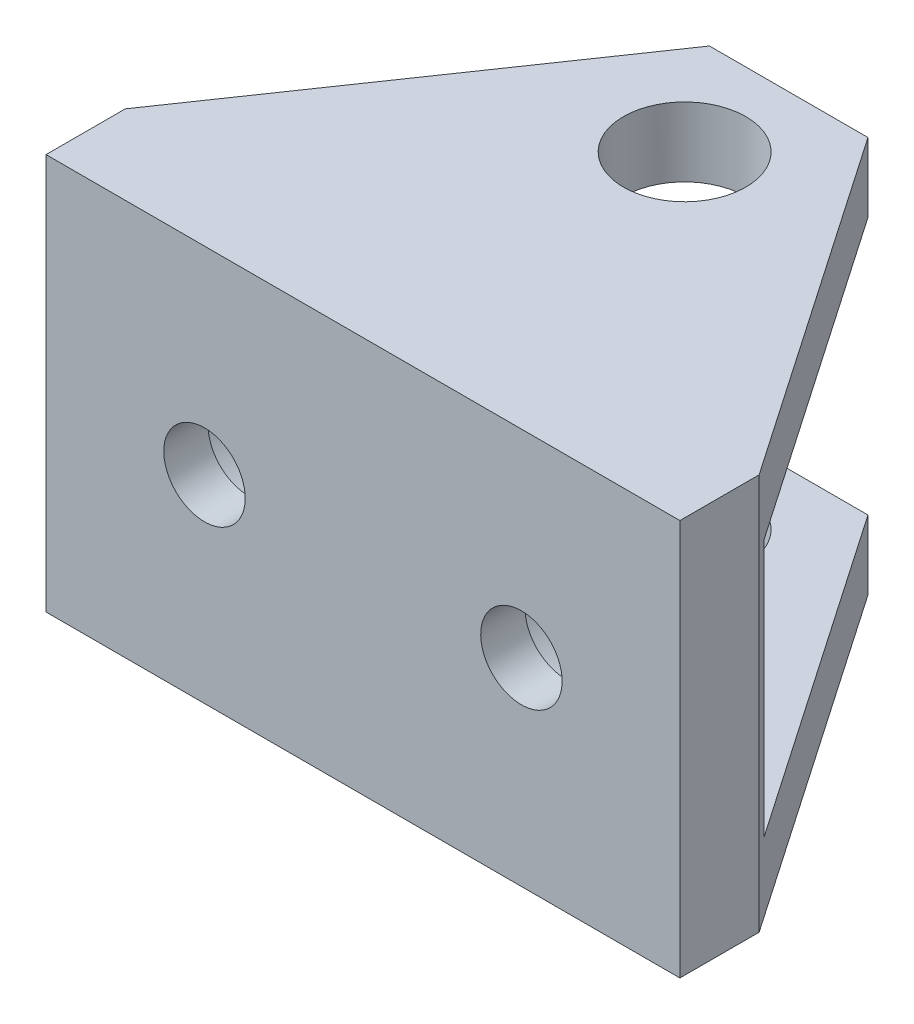
ISO-10303-21;
HEADER;
FILE_DESCRIPTION(('STEP AP214'),'2;1');
FILE_NAME('part.step','',(''),(''),'','','');
FILE_SCHEMA(('AUTOMOTIVE_DESIGN { 1 0 10303 214 1 1 1 1 }'));
ENDSEC;
DATA;
#1=APPLICATION_CONTEXT('core data for automotive mechanical design processes');
#2=APPLICATION_PROTOCOL_DEFINITION('international standard','automotive_design',2000,#1);
#3=PRODUCT_CONTEXT('',#1,'mechanical');
#4=PRODUCT('Part','Part','',(#3));
#5=PRODUCT_RELATED_PRODUCT_CATEGORY('part','',(#4));
#6=PRODUCT_DEFINITION_FORMATION('','',#4);
#7=PRODUCT_DEFINITION_CONTEXT('part definition',#1,'design');
#8=PRODUCT_DEFINITION('design','',#6,#7);
#9=PRODUCT_DEFINITION_SHAPE('','',#8);
#10=(LENGTH_UNIT() NAMED_UNIT(*) SI_UNIT(.MILLI.,.METRE.));
#11=(NAMED_UNIT(*) PLANE_ANGLE_UNIT() SI_UNIT($,.RADIAN.));
#12=(NAMED_UNIT(*) SI_UNIT($,.STERADIAN.) SOLID_ANGLE_UNIT());
#13=UNCERTAINTY_MEASURE_WITH_UNIT(LENGTH_MEASURE(1.E-05),#10,'distance_accuracy_value','');
#14=(GEOMETRIC_REPRESENTATION_CONTEXT(3) GLOBAL_UNCERTAINTY_ASSIGNED_CONTEXT((#13)) GLOBAL_UNIT_ASSIGNED_CONTEXT((#10,
#11,#12)) REPRESENTATION_CONTEXT('',''));
#15=CARTESIAN_POINT('',(0.,0.,0.));
#16=DIRECTION('',(0.,0.,1.));
#17=DIRECTION('',(1.,0.,0.));
#18=AXIS2_PLACEMENT_3D('',#15,#16,#17);
#19=CARTESIAN_POINT('',(50.8,0.,-38.4801142024269));
#20=DIRECTION('',(0.,1.,0.));
#21=DIRECTION('',(0.,0.,1.));
#22=AXIS2_PLACEMENT_3D('',#19,#20,#21);
#23=PLANE('',#22);
#24=CARTESIAN_POINT('',(25.4,0.,-25.7801142024269));
#25=DIRECTION('',(0.,-1.,0.));
#26=DIRECTION('',(0.,0.,-1.));
#27=AXIS2_PLACEMENT_3D('',#24,#25,#26);
#28=CIRCLE('',#27,4.9022);
#29=CARTESIAN_POINT('',(25.4,0.,-30.6823142024269));
#30=VERTEX_POINT('',#29);
#31=EDGE_CURVE('E153',#30,#30,#28,.T.);
#32=ORIENTED_EDGE('',*,*,#31,.F.);
#33=EDGE_LOOP('',(#32));
#34=FACE_BOUND('',#33,.T.);
#35=DIRECTION('',(-1.,0.,0.));
#36=VECTOR('',#35,1.);
#37=CARTESIAN_POINT('',(19.05,0.,-34.1240142024269));
#38=LINE('',#37,#36);
#39=CARTESIAN_POINT('',(31.75,0.,-34.1240142024269));
#40=VERTEX_POINT('',#39);
#41=CARTESIAN_POINT('',(19.05,0.,-34.1240142024269));
#42=VERTEX_POINT('',#41);
#43=EDGE_CURVE('E158',#40,#42,#38,.T.);
#44=ORIENTED_EDGE('',*,*,#43,.F.);
#45=DIRECTION('',(-0.56562855613189,0.,-0.824660133926791));
#46=VECTOR('',#45,1.);
#47=CARTESIAN_POINT('',(31.75,0.,-34.1240142024269));
#48=LINE('',#47,#46);
#49=CARTESIAN_POINT('',(50.8,0.,-6.35));
#50=VERTEX_POINT('',#49);
#51=EDGE_CURVE('E276',#50,#40,#48,.T.);
#52=ORIENTED_EDGE('',*,*,#51,.F.);
#53=DIRECTION('',(0.,0.,-1.));
#54=VECTOR('',#53,1.);
#55=CARTESIAN_POINT('',(50.8,0.,-38.4801142024269));
#56=LINE('',#55,#54);
#57=CARTESIAN_POINT('',(50.8,0.,0.));
#58=VERTEX_POINT('',#57);
#59=EDGE_CURVE('E232',#58,#50,#56,.T.);
#60=ORIENTED_EDGE('',*,*,#59,.F.);
#61=DIRECTION('',(-1.,0.,0.));
#62=VECTOR('',#61,1.);
#63=CARTESIAN_POINT('',(50.8,0.,0.));
#64=LINE('',#63,#62);
#65=CARTESIAN_POINT('',(0.,0.,0.));
#66=VERTEX_POINT('',#65);
#67=EDGE_CURVE('E242',#58,#66,#64,.T.);
#68=ORIENTED_EDGE('',*,*,#67,.T.);
#69=DIRECTION('',(0.,0.,-1.));
#70=VECTOR('',#69,1.);
#71=CARTESIAN_POINT('',(0.,0.,-38.4801142024269));
#72=LINE('',#71,#70);
#73=CARTESIAN_POINT('',(0.,0.,-6.34999999999999));
#74=VERTEX_POINT('',#73);
#75=EDGE_CURVE('E231',#66,#74,#72,.T.);
#76=ORIENTED_EDGE('',*,*,#75,.T.);
#77=DIRECTION('',(-0.56562855613189,0.,0.824660133926791));
#78=VECTOR('',#77,1.);
#79=CARTESIAN_POINT('',(19.05,0.,-34.1240142024269));
#80=LINE('',#79,#78);
#81=EDGE_CURVE('E69',#42,#74,#80,.T.);
#82=ORIENTED_EDGE('',*,*,#81,.F.);
#83=EDGE_LOOP('',(#44,#52,#60,#68,#76,#82));
#84=FACE_BOUND('',#83,.T.);
#85=ADVANCED_FACE('F47',(#34,#84),#23,.F.);
#86=CARTESIAN_POINT('',(50.8,5.5499,-7.62));
#87=DIRECTION('',(0.,-1.,0.));
#88=DIRECTION('',(0.,0.,-1.));
#89=AXIS2_PLACEMENT_3D('',#86,#87,#88);
#90=PLANE('',#89);
#91=CARTESIAN_POINT('',(25.4,5.5499,-25.7801142024269));
#92=DIRECTION('',(0.,-1.,0.));
#93=DIRECTION('',(0.,0.,-1.));
#94=AXIS2_PLACEMENT_3D('',#91,#92,#93);
#95=CIRCLE('',#94,4.9022);
#96=CARTESIAN_POINT('',(25.4,5.5499,-30.6823142024269));
#97=VERTEX_POINT('',#96);
#98=EDGE_CURVE('E188',#97,#97,#95,.T.);
#99=ORIENTED_EDGE('',*,*,#98,.T.);
#100=EDGE_LOOP('',(#99));
#101=FACE_BOUND('',#100,.T.);
#102=DIRECTION('',(-1.,0.,0.));
#103=VECTOR('',#102,1.);
#104=CARTESIAN_POINT('',(50.8,5.5499,-7.62));
#105=LINE('',#104,#103);
#106=CARTESIAN_POINT('',(49.9289159779472,5.5499,-7.62));
#107=VERTEX_POINT('',#106);
#108=CARTESIAN_POINT('',(0.871084022052738,5.5499,-7.62));
#109=VERTEX_POINT('',#108);
#110=EDGE_CURVE('E11',#107,#109,#105,.T.);
#111=ORIENTED_EDGE('',*,*,#110,.F.);
#112=DIRECTION('',(-0.56562855613189,0.,-0.824660133926791));
#113=VECTOR('',#112,1.);
#114=CARTESIAN_POINT('',(50.2076068225172,5.5499,-7.21368170733994));
#115=LINE('',#114,#113);
#116=CARTESIAN_POINT('',(31.75,5.5499,-34.1240142024269));
#117=VERTEX_POINT('',#116);
#118=EDGE_CURVE('E180',#107,#117,#115,.T.);
#119=ORIENTED_EDGE('',*,*,#118,.T.);
#120=DIRECTION('',(-1.,0.,0.));
#121=VECTOR('',#120,1.);
#122=CARTESIAN_POINT('',(50.8,5.5499,-34.1240142024269));
#123=LINE('',#122,#121);
#124=CARTESIAN_POINT('',(19.05,5.5499,-34.1240142024269));
#125=VERTEX_POINT('',#124);
#126=EDGE_CURVE('E195',#117,#125,#123,.T.);
#127=ORIENTED_EDGE('',*,*,#126,.T.);
#128=DIRECTION('',(-0.56562855613189,0.,0.824660133926791));
#129=VECTOR('',#128,1.);
#130=CARTESIAN_POINT('',(16.8451248838846,5.5499,-30.9094088066491));
#131=LINE('',#130,#129);
#132=EDGE_CURVE('E170',#125,#109,#131,.T.);
#133=ORIENTED_EDGE('',*,*,#132,.T.);
#134=EDGE_LOOP('',(#111,#119,#127,#133));
#135=FACE_BOUND('',#134,.T.);
#136=ADVANCED_FACE('F268',(#101,#135),#90,.F.);
#137=CARTESIAN_POINT('',(50.8,26.2001,-7.62));
#138=DIRECTION('',(0.,0.,1.));
#139=DIRECTION('',(0.,-1.,0.));
#140=AXIS2_PLACEMENT_3D('',#137,#138,#139);
#141=PLANE('',#140);
#142=CARTESIAN_POINT('',(38.1,15.875,-7.62));
#143=DIRECTION('',(0.,0.,-1.));
#144=DIRECTION('',(0.,1.,0.));
#145=AXIS2_PLACEMENT_3D('',#142,#143,#144);
#146=CIRCLE('',#145,7.14375);
#147=CARTESIAN_POINT('',(38.1,23.01875,-7.62));
#148=VERTEX_POINT('',#147);
#149=EDGE_CURVE('E199',#148,#148,#146,.T.);
#150=ORIENTED_EDGE('',*,*,#149,.F.);
#151=EDGE_LOOP('',(#150));
#152=FACE_BOUND('',#151,.T.);
#153=CARTESIAN_POINT('',(12.7,15.875,-7.62));
#154=DIRECTION('',(0.,0.,-1.));
#155=DIRECTION('',(0.,1.,0.));
#156=AXIS2_PLACEMENT_3D('',#153,#154,#155);
#157=CIRCLE('',#156,7.14375);
#158=CARTESIAN_POINT('',(12.7,23.01875,-7.62));
#159=VERTEX_POINT('',#158);
#160=EDGE_CURVE('E215',#159,#159,#157,.T.);
#161=ORIENTED_EDGE('',*,*,#160,.F.);
#162=EDGE_LOOP('',(#161));
#163=FACE_BOUND('',#162,.T.);
#164=DIRECTION('',(-1.,0.,0.));
#165=VECTOR('',#164,1.);
#166=CARTESIAN_POINT('',(50.8,26.2001,-7.62));
#167=LINE('',#166,#165);
#168=CARTESIAN_POINT('',(49.9289159779472,26.2001,-7.61999999999999));
#169=VERTEX_POINT('',#168);
#170=CARTESIAN_POINT('',(0.871084022052746,26.2001,-7.62));
#171=VERTEX_POINT('',#170);
#172=EDGE_CURVE('E55',#169,#171,#167,.T.);
#173=ORIENTED_EDGE('',*,*,#172,.F.);
#174=DIRECTION('',(0.,-1.,0.));
#175=VECTOR('',#174,1.);
#176=CARTESIAN_POINT('',(49.9289159779472,26.2001,-7.62));
#177=LINE('',#176,#175);
#178=EDGE_CURVE('E176',#169,#107,#177,.T.);
#179=ORIENTED_EDGE('',*,*,#178,.T.);
#180=ORIENTED_EDGE('',*,*,#110,.T.);
#181=DIRECTION('',(0.,1.,0.));
#182=VECTOR('',#181,1.);
#183=CARTESIAN_POINT('',(0.871084022052736,26.2001,-7.62));
#184=LINE('',#183,#182);
#185=EDGE_CURVE('E166',#109,#171,#184,.T.);
#186=ORIENTED_EDGE('',*,*,#185,.T.);
#187=EDGE_LOOP('',(#173,#179,#180,#186));
#188=FACE_BOUND('',#187,.T.);
#189=ADVANCED_FACE('F263',(#152,#163,#188),#141,.F.);
#190=CARTESIAN_POINT('',(50.8,26.2001,-38.4801142024269));
#191=DIRECTION('',(0.,1.,0.));
#192=DIRECTION('',(0.,0.,1.));
#193=AXIS2_PLACEMENT_3D('',#190,#191,#192);
#194=PLANE('',#193);
#195=CARTESIAN_POINT('',(25.4,26.2001,-25.7801142024269));
#196=DIRECTION('',(0.,1.,0.));
#197=DIRECTION('',(0.,0.,1.));
#198=AXIS2_PLACEMENT_3D('',#195,#196,#197);
#199=CIRCLE('',#198,4.9022);
#200=CARTESIAN_POINT('',(25.4,26.2001,-20.8779142024269));
#201=VERTEX_POINT('',#200);
#202=EDGE_CURVE('E184',#201,#201,#199,.T.);
#203=ORIENTED_EDGE('',*,*,#202,.T.);
#204=EDGE_LOOP('',(#203));
#205=FACE_BOUND('',#204,.T.);
#206=DIRECTION('',(1.,0.,0.));
#207=VECTOR('',#206,1.);
#208=CARTESIAN_POINT('',(50.8,26.2001,-34.1240142024269));
#209=LINE('',#208,#207);
#210=CARTESIAN_POINT('',(19.05,26.2001,-34.1240142024269));
#211=VERTEX_POINT('',#210);
#212=CARTESIAN_POINT('',(31.75,26.2001,-34.1240142024269));
#213=VERTEX_POINT('',#212);
#214=EDGE_CURVE('E192',#211,#213,#209,.T.);
#215=ORIENTED_EDGE('',*,*,#214,.T.);
#216=DIRECTION('',(0.56562855613189,0.,0.824660133926791));
#217=VECTOR('',#216,1.);
#218=CARTESIAN_POINT('',(35.8128657911349,26.2001,-28.200544796362));
#219=LINE('',#218,#217);
#220=EDGE_CURVE('E139',#213,#169,#219,.T.);
#221=ORIENTED_EDGE('',*,*,#220,.T.);
#222=ORIENTED_EDGE('',*,*,#172,.T.);
#223=DIRECTION('',(0.56562855613189,0.,-0.824660133926791));
#224=VECTOR('',#223,1.);
#225=CARTESIAN_POINT('',(31.2398659152669,26.2001,-51.8962718956712));
#226=LINE('',#225,#224);
#227=EDGE_CURVE('E162',#171,#211,#226,.T.);
#228=ORIENTED_EDGE('',*,*,#227,.T.);
#229=EDGE_LOOP('',(#215,#221,#222,#228));
#230=FACE_BOUND('',#229,.T.);
#231=ADVANCED_FACE('F261',(#205,#230),#194,.F.);
#232=CARTESIAN_POINT('',(50.8,31.75,0.));
#233=DIRECTION('',(0.,-1.,0.));
#234=DIRECTION('',(0.,0.,-1.));
#235=AXIS2_PLACEMENT_3D('',#232,#233,#234);
#236=PLANE('',#235);
#237=CARTESIAN_POINT('',(25.4,31.75,-25.7801142024269));
#238=DIRECTION('',(0.,-1.,0.));
#239=DIRECTION('',(0.,0.,-1.));
#240=AXIS2_PLACEMENT_3D('',#237,#238,#239);
#241=CIRCLE('',#240,4.9022);
#242=CARTESIAN_POINT('',(25.4,31.75,-30.6823142024269));
#243=VERTEX_POINT('',#242);
#244=EDGE_CURVE('E157',#243,#243,#241,.F.);
#245=ORIENTED_EDGE('',*,*,#244,.F.);
#246=EDGE_LOOP('',(#245));
#247=FACE_BOUND('',#246,.T.);
#248=DIRECTION('',(0.,0.,1.));
#249=VECTOR('',#248,1.);
#250=CARTESIAN_POINT('',(50.8,31.75,0.));
#251=LINE('',#250,#249);
#252=CARTESIAN_POINT('',(50.8,31.75,-6.35));
#253=VERTEX_POINT('',#252);
#254=CARTESIAN_POINT('',(50.8,31.75,0.));
#255=VERTEX_POINT('',#254);
#256=EDGE_CURVE('E147',#253,#255,#251,.T.);
#257=ORIENTED_EDGE('',*,*,#256,.F.);
#258=DIRECTION('',(0.56562855613189,0.,0.824660133926791));
#259=VECTOR('',#258,1.);
#260=CARTESIAN_POINT('',(31.75,31.75,-34.1240142024269));
#261=LINE('',#260,#259);
#262=CARTESIAN_POINT('',(31.75,31.75,-34.1240142024269));
#263=VERTEX_POINT('',#262);
#264=EDGE_CURVE('E132',#263,#253,#261,.T.);
#265=ORIENTED_EDGE('',*,*,#264,.F.);
#266=DIRECTION('',(1.,0.,0.));
#267=VECTOR('',#266,1.);
#268=CARTESIAN_POINT('',(19.05,31.75,-34.1240142024269));
#269=LINE('',#268,#267);
#270=CARTESIAN_POINT('',(19.05,31.75,-34.1240142024269));
#271=VERTEX_POINT('',#270);
#272=EDGE_CURVE('E123',#271,#263,#269,.T.);
#273=ORIENTED_EDGE('',*,*,#272,.F.);
#274=DIRECTION('',(0.56562855613189,0.,-0.824660133926791));
#275=VECTOR('',#274,1.);
#276=CARTESIAN_POINT('',(19.05,31.75,-34.1240142024269));
#277=LINE('',#276,#275);
#278=CARTESIAN_POINT('',(0.,31.75,-6.35));
#279=VERTEX_POINT('',#278);
#280=EDGE_CURVE('E133',#279,#271,#277,.T.);
#281=ORIENTED_EDGE('',*,*,#280,.F.);
#282=DIRECTION('',(0.,0.,1.));
#283=VECTOR('',#282,1.);
#284=CARTESIAN_POINT('',(0.,31.75,0.));
#285=LINE('',#284,#283);
#286=CARTESIAN_POINT('',(0.,31.75,0.));
#287=VERTEX_POINT('',#286);
#288=EDGE_CURVE('E246',#279,#287,#285,.T.);
#289=ORIENTED_EDGE('',*,*,#288,.T.);
#290=DIRECTION('',(-1.,0.,0.));
#291=VECTOR('',#290,1.);
#292=CARTESIAN_POINT('',(50.8,31.75,0.));
#293=LINE('',#292,#291);
#294=EDGE_CURVE('E254',#255,#287,#293,.T.);
#295=ORIENTED_EDGE('',*,*,#294,.F.);
#296=EDGE_LOOP('',(#257,#265,#273,#281,#289,#295));
#297=FACE_BOUND('',#296,.T.);
#298=ADVANCED_FACE('F145',(#247,#297),#236,.F.);
#299=CARTESIAN_POINT('',(50.8,0.,0.));
#300=DIRECTION('',(0.,0.,-1.));
#301=DIRECTION('',(-1.,0.,0.));
#302=AXIS2_PLACEMENT_3D('',#299,#300,#301);
#303=PLANE('',#302);
#304=CARTESIAN_POINT('',(38.1,15.875,0.));
#305=DIRECTION('',(0.,0.,-1.));
#306=DIRECTION('',(0.,1.,0.));
#307=AXIS2_PLACEMENT_3D('',#304,#305,#306);
#308=CIRCLE('',#307,3.2639);
#309=CARTESIAN_POINT('',(38.1,19.1389,0.));
#310=VERTEX_POINT('',#309);
#311=EDGE_CURVE('E211',#310,#310,#308,.T.);
#312=ORIENTED_EDGE('',*,*,#311,.T.);
#313=EDGE_LOOP('',(#312));
#314=FACE_BOUND('',#313,.T.);
#315=CARTESIAN_POINT('',(12.7,15.875,0.));
#316=DIRECTION('',(0.,0.,-1.));
#317=DIRECTION('',(0.,1.,0.));
#318=AXIS2_PLACEMENT_3D('',#315,#316,#317);
#319=CIRCLE('',#318,3.2639);
#320=CARTESIAN_POINT('',(12.7,19.1389,0.));
#321=VERTEX_POINT('',#320);
#322=EDGE_CURVE('E227',#321,#321,#319,.T.);
#323=ORIENTED_EDGE('',*,*,#322,.T.);
#324=EDGE_LOOP('',(#323));
#325=FACE_BOUND('',#324,.T.);
#326=DIRECTION('',(0.,-1.,0.));
#327=VECTOR('',#326,1.);
#328=CARTESIAN_POINT('',(0.,0.,0.));
#329=LINE('',#328,#327);
#330=EDGE_CURVE('E236',#287,#66,#329,.T.);
#331=ORIENTED_EDGE('',*,*,#330,.T.);
#332=ORIENTED_EDGE('',*,*,#67,.F.);
#333=DIRECTION('',(0.,-1.,0.));
#334=VECTOR('',#333,1.);
#335=CARTESIAN_POINT('',(50.8,0.,0.));
#336=LINE('',#335,#334);
#337=EDGE_CURVE('E239',#255,#58,#336,.T.);
#338=ORIENTED_EDGE('',*,*,#337,.F.);
#339=ORIENTED_EDGE('',*,*,#294,.T.);
#340=EDGE_LOOP('',(#331,#332,#338,#339));
#341=FACE_BOUND('',#340,.T.);
#342=ADVANCED_FACE('F301',(#314,#325,#341),#303,.F.);
#343=CARTESIAN_POINT('',(50.8,0.,0.));
#344=DIRECTION('',(-1.,0.,0.));
#345=DIRECTION('',(0.,0.,1.));
#346=AXIS2_PLACEMENT_3D('',#343,#344,#345);
#347=PLANE('',#346);
#348=ORIENTED_EDGE('',*,*,#59,.T.);
#349=DIRECTION('',(0.,-1.,0.));
#350=VECTOR('',#349,1.);
#351=CARTESIAN_POINT('',(50.8,91.8581046004696,-6.35));
#352=LINE('',#351,#350);
#353=EDGE_CURVE('E141',#253,#50,#352,.T.);
#354=ORIENTED_EDGE('',*,*,#353,.F.);
#355=ORIENTED_EDGE('',*,*,#256,.T.);
#356=ORIENTED_EDGE('',*,*,#337,.T.);
#357=EDGE_LOOP('',(#348,#354,#355,#356));
#358=FACE_BOUND('',#357,.T.);
#359=ADVANCED_FACE('F304',(#358),#347,.F.);
#360=CARTESIAN_POINT('',(0.,0.,0.));
#361=DIRECTION('',(-1.,0.,0.));
#362=DIRECTION('',(0.,0.,1.));
#363=AXIS2_PLACEMENT_3D('',#360,#361,#362);
#364=PLANE('',#363);
#365=DIRECTION('',(0.,-1.,0.));
#366=VECTOR('',#365,1.);
#367=CARTESIAN_POINT('',(0.,91.8581046004696,-6.35));
#368=LINE('',#367,#366);
#369=EDGE_CURVE('E288',#279,#74,#368,.T.);
#370=ORIENTED_EDGE('',*,*,#369,.T.);
#371=ORIENTED_EDGE('',*,*,#75,.F.);
#372=ORIENTED_EDGE('',*,*,#330,.F.);
#373=ORIENTED_EDGE('',*,*,#288,.F.);
#374=EDGE_LOOP('',(#370,#371,#372,#373));
#375=FACE_BOUND('',#374,.T.);
#376=ADVANCED_FACE('F297',(#375),#364,.T.);
#377=CARTESIAN_POINT('',(12.7,15.875,-7.62));
#378=DIRECTION('',(0.,0.,-1.));
#379=DIRECTION('',(0.,1.,0.));
#380=AXIS2_PLACEMENT_3D('',#377,#378,#379);
#381=CYLINDRICAL_SURFACE('',#380,3.2639);
#382=ORIENTED_EDGE('',*,*,#322,.F.);
#383=EDGE_LOOP('',(#382));
#384=FACE_BOUND('',#383,.T.);
#385=CARTESIAN_POINT('',(12.7,15.875,-3.556));
#386=DIRECTION('',(0.,0.,-1.));
#387=DIRECTION('',(0.,1.,0.));
#388=AXIS2_PLACEMENT_3D('',#385,#386,#387);
#389=CIRCLE('',#388,3.2639);
#390=CARTESIAN_POINT('',(12.7,19.1389,-3.556));
#391=VERTEX_POINT('',#390);
#392=EDGE_CURVE('E223',#391,#391,#389,.T.);
#393=ORIENTED_EDGE('',*,*,#392,.T.);
#394=EDGE_LOOP('',(#393));
#395=FACE_BOUND('',#394,.T.);
#396=ADVANCED_FACE('F311',(#384,#395),#381,.F.);
#397=CARTESIAN_POINT('',(15.9639,15.875,-3.556));
#398=DIRECTION('',(0.,0.,1.));
#399=DIRECTION('',(0.,-1.,0.));
#400=AXIS2_PLACEMENT_3D('',#397,#398,#399);
#401=PLANE('',#400);
#402=ORIENTED_EDGE('',*,*,#392,.F.);
#403=EDGE_LOOP('',(#402));
#404=FACE_BOUND('',#403,.T.);
#405=CARTESIAN_POINT('',(12.7,15.875,-3.556));
#406=DIRECTION('',(0.,0.,-1.));
#407=DIRECTION('',(0.,1.,0.));
#408=AXIS2_PLACEMENT_3D('',#405,#406,#407);
#409=CIRCLE('',#408,7.14375);
#410=CARTESIAN_POINT('',(12.7,23.01875,-3.556));
#411=VERTEX_POINT('',#410);
#412=EDGE_CURVE('E219',#411,#411,#409,.T.);
#413=ORIENTED_EDGE('',*,*,#412,.T.);
#414=EDGE_LOOP('',(#413));
#415=FACE_BOUND('',#414,.T.);
#416=ADVANCED_FACE('F353',(#404,#415),#401,.F.);
#417=CARTESIAN_POINT('',(12.7,15.875,-7.62));
#418=DIRECTION('',(0.,0.,-1.));
#419=DIRECTION('',(0.,1.,0.));
#420=AXIS2_PLACEMENT_3D('',#417,#418,#419);
#421=CYLINDRICAL_SURFACE('',#420,7.14375);
#422=ORIENTED_EDGE('',*,*,#412,.F.);
#423=EDGE_LOOP('',(#422));
#424=FACE_BOUND('',#423,.T.);
#425=ORIENTED_EDGE('',*,*,#160,.T.);
#426=EDGE_LOOP('',(#425));
#427=FACE_BOUND('',#426,.T.);
#428=ADVANCED_FACE('F349',(#424,#427),#421,.F.);
#429=CARTESIAN_POINT('',(38.1,15.875,-7.62));
#430=DIRECTION('',(0.,0.,-1.));
#431=DIRECTION('',(0.,1.,0.));
#432=AXIS2_PLACEMENT_3D('',#429,#430,#431);
#433=CYLINDRICAL_SURFACE('',#432,3.2639);
#434=ORIENTED_EDGE('',*,*,#311,.F.);
#435=EDGE_LOOP('',(#434));
#436=FACE_BOUND('',#435,.T.);
#437=CARTESIAN_POINT('',(38.1,15.875,-3.556));
#438=DIRECTION('',(0.,0.,-1.));
#439=DIRECTION('',(0.,1.,0.));
#440=AXIS2_PLACEMENT_3D('',#437,#438,#439);
#441=CIRCLE('',#440,3.2639);
#442=CARTESIAN_POINT('',(38.1,19.1389,-3.556));
#443=VERTEX_POINT('',#442);
#444=EDGE_CURVE('E207',#443,#443,#441,.T.);
#445=ORIENTED_EDGE('',*,*,#444,.T.);
#446=EDGE_LOOP('',(#445));
#447=FACE_BOUND('',#446,.T.);
#448=ADVANCED_FACE('F345',(#436,#447),#433,.F.);
#449=CARTESIAN_POINT('',(41.3639,15.875,-3.556));
#450=DIRECTION('',(0.,0.,1.));
#451=DIRECTION('',(0.,-1.,0.));
#452=AXIS2_PLACEMENT_3D('',#449,#450,#451);
#453=PLANE('',#452);
#454=ORIENTED_EDGE('',*,*,#444,.F.);
#455=EDGE_LOOP('',(#454));
#456=FACE_BOUND('',#455,.T.);
#457=CARTESIAN_POINT('',(38.1,15.875,-3.556));
#458=DIRECTION('',(0.,0.,-1.));
#459=DIRECTION('',(0.,1.,0.));
#460=AXIS2_PLACEMENT_3D('',#457,#458,#459);
#461=CIRCLE('',#460,7.14375);
#462=CARTESIAN_POINT('',(38.1,23.01875,-3.556));
#463=VERTEX_POINT('',#462);
#464=EDGE_CURVE('E203',#463,#463,#461,.T.);
#465=ORIENTED_EDGE('',*,*,#464,.T.);
#466=EDGE_LOOP('',(#465));
#467=FACE_BOUND('',#466,.T.);
#468=ADVANCED_FACE('F341',(#456,#467),#453,.F.);
#469=CARTESIAN_POINT('',(38.1,15.875,-7.62));
#470=DIRECTION('',(0.,0.,-1.));
#471=DIRECTION('',(0.,1.,0.));
#472=AXIS2_PLACEMENT_3D('',#469,#470,#471);
#473=CYLINDRICAL_SURFACE('',#472,7.14375);
#474=ORIENTED_EDGE('',*,*,#464,.F.);
#475=EDGE_LOOP('',(#474));
#476=FACE_BOUND('',#475,.T.);
#477=ORIENTED_EDGE('',*,*,#149,.T.);
#478=EDGE_LOOP('',(#477));
#479=FACE_BOUND('',#478,.T.);
#480=ADVANCED_FACE('F339',(#476,#479),#473,.F.);
#481=CARTESIAN_POINT('',(19.05,91.8581046004696,-34.1240142024269));
#482=DIRECTION('',(0.,0.,1.));
#483=DIRECTION('',(1.,0.,0.));
#484=AXIS2_PLACEMENT_3D('',#481,#482,#483);
#485=PLANE('',#484);
#486=DIRECTION('',(0.,-1.,0.));
#487=VECTOR('',#486,1.);
#488=CARTESIAN_POINT('',(31.75,91.8581046004696,-34.1240142024269));
#489=LINE('',#488,#487);
#490=EDGE_CURVE('E142',#117,#40,#489,.T.);
#491=ORIENTED_EDGE('',*,*,#490,.T.);
#492=ORIENTED_EDGE('',*,*,#43,.T.);
#493=DIRECTION('',(0.,-1.,0.));
#494=VECTOR('',#493,1.);
#495=CARTESIAN_POINT('',(19.05,91.8581046004696,-34.1240142024269));
#496=LINE('',#495,#494);
#497=EDGE_CURVE('E274',#125,#42,#496,.T.);
#498=ORIENTED_EDGE('',*,*,#497,.F.);
#499=ORIENTED_EDGE('',*,*,#126,.F.);
#500=EDGE_LOOP('',(#491,#492,#498,#499));
#501=FACE_BOUND('',#500,.T.);
#502=ADVANCED_FACE('F271',(#501),#485,.F.);
#503=EDGE_CURVE('E62',#271,#211,#496,.T.);
#504=ORIENTED_EDGE('',*,*,#503,.F.);
#505=ORIENTED_EDGE('',*,*,#272,.T.);
#506=EDGE_CURVE('E126',#263,#213,#489,.T.);
#507=ORIENTED_EDGE('',*,*,#506,.T.);
#508=ORIENTED_EDGE('',*,*,#214,.F.);
#509=EDGE_LOOP('',(#504,#505,#507,#508));
#510=FACE_BOUND('',#509,.T.);
#511=ADVANCED_FACE('F125',(#510),#485,.F.);
#512=CARTESIAN_POINT('',(31.75,91.8581046004696,-34.1240142024269));
#513=DIRECTION('',(-0.824660133926791,0.,0.56562855613189));
#514=DIRECTION('',(0.56562855613189,0.,0.824660133926791));
#515=AXIS2_PLACEMENT_3D('',#512,#513,#514);
#516=PLANE('',#515);
#517=ORIENTED_EDGE('',*,*,#178,.F.);
#518=ORIENTED_EDGE('',*,*,#220,.F.);
#519=ORIENTED_EDGE('',*,*,#506,.F.);
#520=ORIENTED_EDGE('',*,*,#264,.T.);
#521=ORIENTED_EDGE('',*,*,#353,.T.);
#522=ORIENTED_EDGE('',*,*,#51,.T.);
#523=ORIENTED_EDGE('',*,*,#490,.F.);
#524=ORIENTED_EDGE('',*,*,#118,.F.);
#525=EDGE_LOOP('',(#517,#518,#519,#520,#521,#522,#523,#524));
#526=FACE_BOUND('',#525,.T.);
#527=ADVANCED_FACE('F136',(#526),#516,.F.);
#528=CARTESIAN_POINT('',(19.05,91.8581046004696,-34.1240142024269));
#529=DIRECTION('',(0.824660133926791,0.,0.56562855613189));
#530=DIRECTION('',(0.56562855613189,0.,-0.824660133926791));
#531=AXIS2_PLACEMENT_3D('',#528,#529,#530);
#532=PLANE('',#531);
#533=ORIENTED_EDGE('',*,*,#497,.T.);
#534=ORIENTED_EDGE('',*,*,#81,.T.);
#535=ORIENTED_EDGE('',*,*,#369,.F.);
#536=ORIENTED_EDGE('',*,*,#280,.T.);
#537=ORIENTED_EDGE('',*,*,#503,.T.);
#538=ORIENTED_EDGE('',*,*,#227,.F.);
#539=ORIENTED_EDGE('',*,*,#185,.F.);
#540=ORIENTED_EDGE('',*,*,#132,.F.);
#541=EDGE_LOOP('',(#533,#534,#535,#536,#537,#538,#539,#540));
#542=FACE_BOUND('',#541,.T.);
#543=ADVANCED_FACE('F265',(#542),#532,.F.);
#544=CARTESIAN_POINT('',(25.4,91.8581046004696,-25.7801142024269));
#545=DIRECTION('',(0.,-1.,0.));
#546=DIRECTION('',(0.,0.,-1.));
#547=AXIS2_PLACEMENT_3D('',#544,#545,#546);
#548=CYLINDRICAL_SURFACE('',#547,4.9022);
#549=ORIENTED_EDGE('',*,*,#244,.T.);
#550=EDGE_LOOP('',(#549));
#551=FACE_BOUND('',#550,.T.);
#552=ORIENTED_EDGE('',*,*,#202,.F.);
#553=EDGE_LOOP('',(#552));
#554=FACE_BOUND('',#553,.T.);
#555=ADVANCED_FACE('F329',(#551,#554),#548,.F.);
#556=ORIENTED_EDGE('',*,*,#31,.T.);
#557=EDGE_LOOP('',(#556));
#558=FACE_BOUND('',#557,.T.);
#559=ORIENTED_EDGE('',*,*,#98,.F.);
#560=EDGE_LOOP('',(#559));
#561=FACE_BOUND('',#560,.T.);
#562=ADVANCED_FACE('F326',(#558,#561),#548,.F.);
#563=CLOSED_SHELL('',(#85,#136,#189,#231,#298,#342,#359,#376,#396,#416,#428,#448,#468,#480,#502,
#511,#527,#543,#555,#562));
#564=MANIFOLD_SOLID_BREP('B2',#563);
#565=ADVANCED_BREP_SHAPE_REPRESENTATION('',(#18,#564),#14);
#566=SHAPE_DEFINITION_REPRESENTATION(#9,#565);
ENDSEC;
END-ISO-10303-21;
